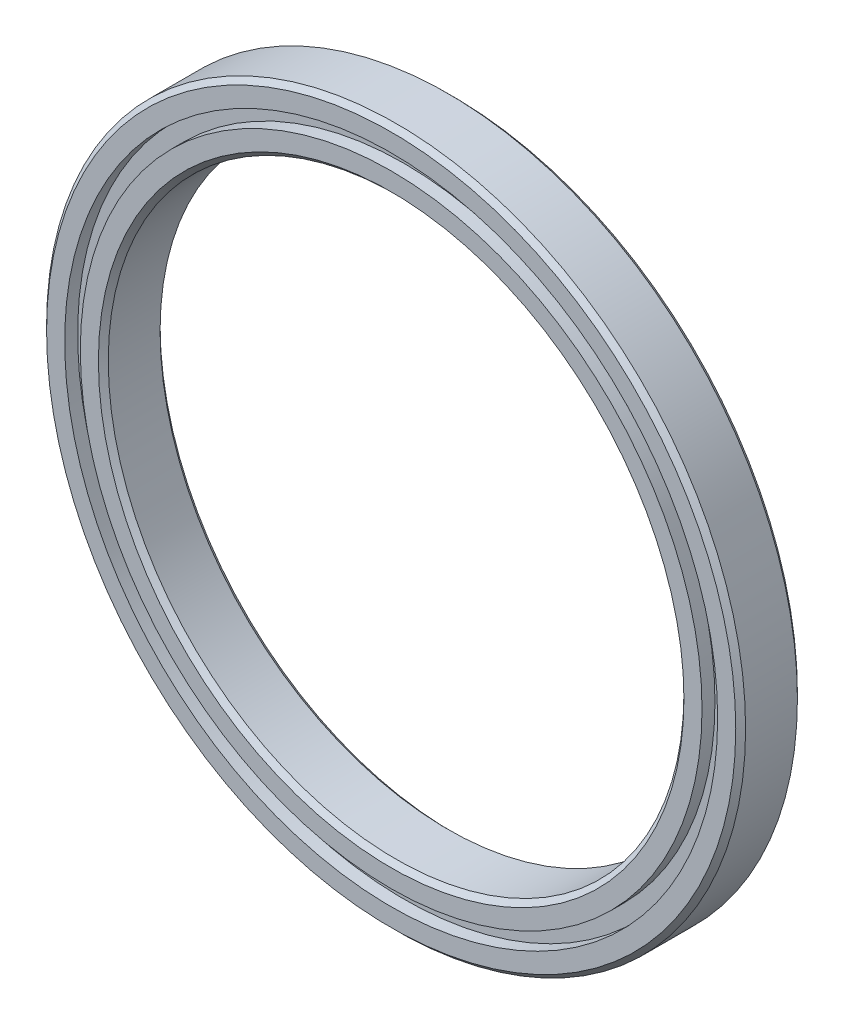
ISO-10303-21;
HEADER;
FILE_DESCRIPTION(('STEP AP214'),'2;1');
FILE_NAME('part.step','',(''),(''),'','','');
FILE_SCHEMA(('AUTOMOTIVE_DESIGN { 1 0 10303 214 1 1 1 1 }'));
ENDSEC;
DATA;
#1=APPLICATION_CONTEXT('core data for automotive mechanical design processes');
#2=APPLICATION_PROTOCOL_DEFINITION('international standard','automotive_design',2000,#1);
#3=PRODUCT_CONTEXT('',#1,'mechanical');
#4=PRODUCT('Part','Part','',(#3));
#5=PRODUCT_RELATED_PRODUCT_CATEGORY('part','',(#4));
#6=PRODUCT_DEFINITION_FORMATION('','',#4);
#7=PRODUCT_DEFINITION_CONTEXT('part definition',#1,'design');
#8=PRODUCT_DEFINITION('design','',#6,#7);
#9=PRODUCT_DEFINITION_SHAPE('','',#8);
#10=(LENGTH_UNIT() NAMED_UNIT(*) SI_UNIT(.MILLI.,.METRE.));
#11=(NAMED_UNIT(*) PLANE_ANGLE_UNIT() SI_UNIT($,.RADIAN.));
#12=(NAMED_UNIT(*) SI_UNIT($,.STERADIAN.) SOLID_ANGLE_UNIT());
#13=UNCERTAINTY_MEASURE_WITH_UNIT(LENGTH_MEASURE(1.E-05),#10,'distance_accuracy_value','');
#14=(GEOMETRIC_REPRESENTATION_CONTEXT(3) GLOBAL_UNCERTAINTY_ASSIGNED_CONTEXT((#13)) GLOBAL_UNIT_ASSIGNED_CONTEXT((#10,
#11,#12)) REPRESENTATION_CONTEXT('',''));
#15=CARTESIAN_POINT('',(0.,0.,0.));
#16=DIRECTION('',(0.,0.,1.));
#17=DIRECTION('',(1.,0.,0.));
#18=AXIS2_PLACEMENT_3D('',#15,#16,#17);
#19=CARTESIAN_POINT('',(-4.53884847591723,-45.5319593320098,0.));
#20=DIRECTION('',(0.,0.,1.));
#21=DIRECTION('',(1.,0.,0.));
#22=AXIS2_PLACEMENT_3D('',#19,#20,#21);
#23=PLANE('',#22);
#24=CARTESIAN_POINT('',(-4.53884847591723,-45.5319593320098,0.));
#25=DIRECTION('',(0.,0.,1.));
#26=DIRECTION('',(1.,0.,0.));
#27=AXIS2_PLACEMENT_3D('',#24,#25,#26);
#28=CIRCLE('',#27,22.606);
#29=CARTESIAN_POINT('',(18.0671515240827,-45.5319593320098,0.));
#30=VERTEX_POINT('',#29);
#31=EDGE_CURVE('E59',#30,#30,#28,.T.);
#32=ORIENTED_EDGE('',*,*,#31,.T.);
#33=EDGE_LOOP('',(#32));
#34=FACE_BOUND('',#33,.T.);
#35=CARTESIAN_POINT('',(-4.53884847591723,-45.5319593320098,0.));
#36=DIRECTION('',(0.,0.,-1.));
#37=DIRECTION('',(-1.,0.,0.));
#38=AXIS2_PLACEMENT_3D('',#35,#36,#37);
#39=CIRCLE('',#38,24.003);
#40=CARTESIAN_POINT('',(-28.5418484759172,-45.5319593320098,0.));
#41=VERTEX_POINT('',#40);
#42=EDGE_CURVE('E83',#41,#41,#39,.T.);
#43=ORIENTED_EDGE('',*,*,#42,.T.);
#44=EDGE_LOOP('',(#43));
#45=FACE_BOUND('',#44,.T.);
#46=ADVANCED_FACE('F30',(#34,#45),#23,.F.);
#47=CARTESIAN_POINT('',(-4.53884847591723,-45.5319593320098,4.7625));
#48=DIRECTION('',(0.,0.,1.));
#49=DIRECTION('',(1.,0.,0.));
#50=AXIS2_PLACEMENT_3D('',#47,#48,#49);
#51=PLANE('',#50);
#52=CARTESIAN_POINT('',(-4.53884847591723,-45.5319593320098,4.7625));
#53=DIRECTION('',(0.,0.,1.));
#54=DIRECTION('',(1.,0.,0.));
#55=AXIS2_PLACEMENT_3D('',#52,#53,#54);
#56=CIRCLE('',#55,22.6060000000001);
#57=CARTESIAN_POINT('',(18.0671515240828,-45.5319593320098,4.7625));
#58=VERTEX_POINT('',#57);
#59=EDGE_CURVE('E37',#58,#58,#56,.F.);
#60=ORIENTED_EDGE('',*,*,#59,.T.);
#61=EDGE_LOOP('',(#60));
#62=FACE_BOUND('',#61,.T.);
#63=CARTESIAN_POINT('',(-4.53884847591723,-45.5319593320098,4.7625));
#64=DIRECTION('',(0.,0.,1.));
#65=DIRECTION('',(1.,0.,0.));
#66=AXIS2_PLACEMENT_3D('',#63,#64,#65);
#67=CIRCLE('',#66,24.003);
#68=CARTESIAN_POINT('',(19.4641515240828,-45.5319593320098,4.7625));
#69=VERTEX_POINT('',#68);
#70=EDGE_CURVE('E71',#69,#69,#67,.T.);
#71=ORIENTED_EDGE('',*,*,#70,.T.);
#72=EDGE_LOOP('',(#71));
#73=FACE_BOUND('',#72,.T.);
#74=ADVANCED_FACE('F105',(#62,#73),#51,.T.);
#75=CARTESIAN_POINT('',(-4.53884847591723,-45.5319593320098,4.7625));
#76=DIRECTION('',(0.,0.,1.));
#77=DIRECTION('',(1.,0.,0.));
#78=AXIS2_PLACEMENT_3D('',#75,#76,#77);
#79=CIRCLE('',#78,26.6065);
#80=CARTESIAN_POINT('',(22.0676515240828,-45.5319593320098,4.7625));
#81=VERTEX_POINT('',#80);
#82=EDGE_CURVE('E10',#81,#81,#79,.T.);
#83=ORIENTED_EDGE('',*,*,#82,.T.);
#84=EDGE_LOOP('',(#83));
#85=FACE_BOUND('',#84,.T.);
#86=CARTESIAN_POINT('',(-4.53884847591723,-45.5319593320098,4.7625));
#87=DIRECTION('',(0.,0.,1.));
#88=DIRECTION('',(1.,0.,0.));
#89=AXIS2_PLACEMENT_3D('',#86,#87,#88);
#90=CIRCLE('',#89,25.2095);
#91=CARTESIAN_POINT('',(20.6706515240828,-45.5319593320098,4.7625));
#92=VERTEX_POINT('',#91);
#93=EDGE_CURVE('E65',#92,#92,#90,.T.);
#94=ORIENTED_EDGE('',*,*,#93,.F.);
#95=EDGE_LOOP('',(#94));
#96=FACE_BOUND('',#95,.T.);
#97=ADVANCED_FACE('F112',(#85,#96),#51,.T.);
#98=CARTESIAN_POINT('',(-4.53884847591723,-45.5319593320098,0.));
#99=DIRECTION('',(0.,0.,1.));
#100=DIRECTION('',(1.,0.,0.));
#101=AXIS2_PLACEMENT_3D('',#98,#99,#100);
#102=CIRCLE('',#101,26.6065);
#103=CARTESIAN_POINT('',(22.0676515240827,-45.5319593320098,0.));
#104=VERTEX_POINT('',#103);
#105=EDGE_CURVE('E41',#104,#104,#102,.F.);
#106=ORIENTED_EDGE('',*,*,#105,.T.);
#107=EDGE_LOOP('',(#106));
#108=FACE_BOUND('',#107,.T.);
#109=CARTESIAN_POINT('',(-4.53884847591723,-45.5319593320098,0.));
#110=DIRECTION('',(0.,0.,-1.));
#111=DIRECTION('',(-1.,0.,0.));
#112=AXIS2_PLACEMENT_3D('',#109,#110,#111);
#113=CIRCLE('',#112,25.2095);
#114=CARTESIAN_POINT('',(-29.7483484759172,-45.5319593320098,0.));
#115=VERTEX_POINT('',#114);
#116=EDGE_CURVE('E77',#115,#115,#113,.T.);
#117=ORIENTED_EDGE('',*,*,#116,.F.);
#118=EDGE_LOOP('',(#117));
#119=FACE_BOUND('',#118,.T.);
#120=ADVANCED_FACE('F108',(#108,#119),#23,.F.);
#121=CARTESIAN_POINT('',(-4.53884847591723,-45.5319593320098,4.7625));
#122=DIRECTION('',(0.,0.,-1.));
#123=DIRECTION('',(-1.,0.,0.));
#124=AXIS2_PLACEMENT_3D('',#121,#122,#123);
#125=CYLINDRICAL_SURFACE('',#124,26.9875);
#126=CARTESIAN_POINT('',(-4.53884847591723,-45.5319593320098,0.381000000000034));
#127=DIRECTION('',(0.,0.,1.));
#128=DIRECTION('',(1.,0.,0.));
#129=AXIS2_PLACEMENT_3D('',#126,#127,#128);
#130=CIRCLE('',#129,26.9875);
#131=CARTESIAN_POINT('',(-31.5263484759172,-45.5319593320098,0.381000000000034));
#132=VERTEX_POINT('',#131);
#133=EDGE_CURVE('E45',#132,#132,#130,.T.);
#134=CARTESIAN_POINT('',(-4.53884847591723,-45.5319593320098,4.38150000000002));
#135=DIRECTION('',(0.,0.,1.));
#136=DIRECTION('',(1.,0.,0.));
#137=AXIS2_PLACEMENT_3D('',#134,#135,#136);
#138=CIRCLE('',#137,26.9875);
#139=CARTESIAN_POINT('',(-31.5263484759172,-45.5319593320098,4.38150000000002));
#140=VERTEX_POINT('',#139);
#141=EDGE_CURVE('E50',#140,#140,#138,.F.);
#142=CARTESIAN_POINT('',(-31.5263484759172,-45.5319593320098,0.381000000000034));
#143=CARTESIAN_POINT('',(-31.5263484759172,-45.5319593320098,0.422671875000034));
#144=CARTESIAN_POINT('',(-31.5263484759172,-45.5319593320098,0.464343750000034));
#145=CARTESIAN_POINT('',(-31.5263484759172,-45.5319593320098,0.547687500000033));
#146=CARTESIAN_POINT('',(-31.5263484759172,-45.5319593320098,0.589359375000033));
#147=CARTESIAN_POINT('',(-31.5263484759172,-45.5319593320098,0.672703125000032));
#148=CARTESIAN_POINT('',(-31.5263484759172,-45.5319593320098,0.714375000000032));
#149=CARTESIAN_POINT('',(-31.5263484759172,-45.5319593320098,0.797718750000032));
#150=CARTESIAN_POINT('',(-31.5263484759172,-45.5319593320098,0.839390625000032));
#151=CARTESIAN_POINT('',(-31.5263484759172,-45.5319593320098,0.922734375000031));
#152=CARTESIAN_POINT('',(-31.5263484759172,-45.5319593320098,0.964406250000031));
#153=CARTESIAN_POINT('',(-31.5263484759172,-45.5319593320098,1.04775000000003));
#154=CARTESIAN_POINT('',(-31.5263484759172,-45.5319593320098,1.08942187500003));
#155=CARTESIAN_POINT('',(-31.5263484759172,-45.5319593320098,1.17276562500003));
#156=CARTESIAN_POINT('',(-31.5263484759172,-45.5319593320098,1.21443750000003));
#157=CARTESIAN_POINT('',(-31.5263484759172,-45.5319593320098,1.29778125000003));
#158=CARTESIAN_POINT('',(-31.5263484759172,-45.5319593320098,1.33945312500003));
#159=CARTESIAN_POINT('',(-31.5263484759172,-45.5319593320098,1.42279687500003));
#160=CARTESIAN_POINT('',(-31.5263484759172,-45.5319593320098,1.46446875000003));
#161=CARTESIAN_POINT('',(-31.5263484759172,-45.5319593320098,1.54781250000003));
#162=CARTESIAN_POINT('',(-31.5263484759172,-45.5319593320098,1.58948437500003));
#163=CARTESIAN_POINT('',(-31.5263484759172,-45.5319593320098,1.67282812500003));
#164=CARTESIAN_POINT('',(-31.5263484759172,-45.5319593320098,1.71450000000003));
#165=CARTESIAN_POINT('',(-31.5263484759172,-45.5319593320098,1.79784375000003));
#166=CARTESIAN_POINT('',(-31.5263484759172,-45.5319593320098,1.83951562500003));
#167=CARTESIAN_POINT('',(-31.5263484759172,-45.5319593320098,1.92285937500003));
#168=CARTESIAN_POINT('',(-31.5263484759172,-45.5319593320098,1.96453125000003));
#169=CARTESIAN_POINT('',(-31.5263484759172,-45.5319593320098,2.04787500000003));
#170=CARTESIAN_POINT('',(-31.5263484759172,-45.5319593320098,2.08954687500003));
#171=CARTESIAN_POINT('',(-31.5263484759172,-45.5319593320098,2.17289062500003));
#172=CARTESIAN_POINT('',(-31.5263484759172,-45.5319593320098,2.21456250000003));
#173=CARTESIAN_POINT('',(-31.5263484759172,-45.5319593320098,2.29790625000002));
#174=CARTESIAN_POINT('',(-31.5263484759172,-45.5319593320098,2.33957812500002));
#175=CARTESIAN_POINT('',(-31.5263484759172,-45.5319593320098,2.42292187500002));
#176=CARTESIAN_POINT('',(-31.5263484759172,-45.5319593320098,2.46459375000002));
#177=CARTESIAN_POINT('',(-31.5263484759172,-45.5319593320098,2.54793750000002));
#178=CARTESIAN_POINT('',(-31.5263484759172,-45.5319593320098,2.58960937500002));
#179=CARTESIAN_POINT('',(-31.5263484759172,-45.5319593320098,2.67295312500002));
#180=CARTESIAN_POINT('',(-31.5263484759172,-45.5319593320098,2.71462500000002));
#181=CARTESIAN_POINT('',(-31.5263484759172,-45.5319593320098,2.79796875000002));
#182=CARTESIAN_POINT('',(-31.5263484759172,-45.5319593320098,2.83964062500002));
#183=CARTESIAN_POINT('',(-31.5263484759172,-45.5319593320098,2.92298437500002));
#184=CARTESIAN_POINT('',(-31.5263484759172,-45.5319593320098,2.96465625000002));
#185=CARTESIAN_POINT('',(-31.5263484759172,-45.5319593320098,3.04800000000002));
#186=CARTESIAN_POINT('',(-31.5263484759172,-45.5319593320098,3.08967187500002));
#187=CARTESIAN_POINT('',(-31.5263484759172,-45.5319593320098,3.17301562500002));
#188=CARTESIAN_POINT('',(-31.5263484759172,-45.5319593320098,3.21468750000002));
#189=CARTESIAN_POINT('',(-31.5263484759172,-45.5319593320098,3.29803125000002));
#190=CARTESIAN_POINT('',(-31.5263484759172,-45.5319593320098,3.33970312500002));
#191=CARTESIAN_POINT('',(-31.5263484759172,-45.5319593320098,3.42304687500002));
#192=CARTESIAN_POINT('',(-31.5263484759172,-45.5319593320098,3.46471875000002));
#193=CARTESIAN_POINT('',(-31.5263484759172,-45.5319593320098,3.54806250000002));
#194=CARTESIAN_POINT('',(-31.5263484759172,-45.5319593320098,3.58973437500002));
#195=CARTESIAN_POINT('',(-31.5263484759172,-45.5319593320098,3.67307812500002));
#196=CARTESIAN_POINT('',(-31.5263484759172,-45.5319593320098,3.71475000000002));
#197=CARTESIAN_POINT('',(-31.5263484759172,-45.5319593320098,3.79809375000002));
#198=CARTESIAN_POINT('',(-31.5263484759172,-45.5319593320098,3.83976562500002));
#199=CARTESIAN_POINT('',(-31.5263484759172,-45.5319593320098,3.92310937500002));
#200=CARTESIAN_POINT('',(-31.5263484759172,-45.5319593320098,3.96478125000002));
#201=CARTESIAN_POINT('',(-31.5263484759172,-45.5319593320098,4.04812500000002));
#202=CARTESIAN_POINT('',(-31.5263484759172,-45.5319593320098,4.08979687500002));
#203=CARTESIAN_POINT('',(-31.5263484759172,-45.5319593320098,4.17314062500002));
#204=CARTESIAN_POINT('',(-31.5263484759172,-45.5319593320098,4.21481250000002));
#205=CARTESIAN_POINT('',(-31.5263484759172,-45.5319593320098,4.29815625000002));
#206=CARTESIAN_POINT('',(-31.5263484759172,-45.5319593320098,4.33982812500002));
#207=CARTESIAN_POINT('',(-31.5263484759172,-45.5319593320098,4.38150000000002));
#208=B_SPLINE_CURVE_WITH_KNOTS('',3,(#142,#143,#144,#145,#146,#147,#148,#149,#150,#151,#152,
#153,#154,#155,#156,#157,#158,#159,#160,#161,#162,#163,#164,#165,#166,#167,#168,#169,#170,#171,
#172,#173,#174,#175,#176,#177,#178,#179,#180,#181,#182,#183,#184,#185,#186,#187,#188,#189,#190,
#191,#192,#193,#194,#195,#196,#197,#198,#199,#200,#201,#202,#203,#204,#205,#206,#207),
.UNSPECIFIED.,.F.,.F.,(4,2,2,2,2,2,2,2,2,2,2,2,2,2,2,2,2,2,2,2,2,2,2,2,2,2,2,2,2,2,2,2,4),(0.,
0.125015625,0.250031249999999,0.375046874999998,0.500062499999998,0.625078124999997,
0.750093749999996,0.875109374999996,1.000125,1.12514062499999,1.25015624999999,1.37517187499999,
1.50018749999999,1.62520312499999,1.75021874999999,1.87523437499999,2.00024999999999,
2.12526562499999,2.25028124999999,2.37529687499999,2.50031249999999,2.62532812499999,
2.75034374999999,2.87535937499999,3.00037499999999,3.12539062499998,3.25040624999998,
3.37542187499998,3.50043749999998,3.62545312499998,3.75046874999998,3.87548437499998,
4.00049999999998),.UNSPECIFIED.);
#209=EDGE_CURVE('BSEAM32',#132,#140,#208,.T.);
#210=ORIENTED_EDGE('',*,*,#133,.T.);
#211=ORIENTED_EDGE('',*,*,#141,.T.);
#212=ORIENTED_EDGE('',*,*,#209,.T.);
#213=ORIENTED_EDGE('',*,*,#209,.F.);
#214=EDGE_LOOP('',(#210,#212,#211,#213));
#215=FACE_BOUND('',#214,.T.);
#216=ADVANCED_FACE('F32',(#215),#125,.T.);
#217=CARTESIAN_POINT('',(-4.53884847591723,-45.5319593320098,4.7625));
#218=DIRECTION('',(0.,0.,-1.));
#219=DIRECTION('',(-1.,0.,0.));
#220=AXIS2_PLACEMENT_3D('',#217,#218,#219);
#221=CYLINDRICAL_SURFACE('',#220,22.225);
#222=CARTESIAN_POINT('',(-4.53884847591723,-45.5319593320098,0.380999999999982));
#223=DIRECTION('',(0.,0.,1.));
#224=DIRECTION('',(1.,0.,0.));
#225=AXIS2_PLACEMENT_3D('',#222,#223,#224);
#226=CIRCLE('',#225,22.225);
#227=CARTESIAN_POINT('',(-26.7638484759172,-45.5319593320098,0.380999999999982));
#228=VERTEX_POINT('',#227);
#229=EDGE_CURVE('E53',#228,#228,#226,.F.);
#230=CARTESIAN_POINT('',(-4.53884847591723,-45.5319593320098,4.38149999999993));
#231=DIRECTION('',(0.,0.,1.));
#232=DIRECTION('',(1.,0.,0.));
#233=AXIS2_PLACEMENT_3D('',#230,#231,#232);
#234=CIRCLE('',#233,22.225);
#235=CARTESIAN_POINT('',(-26.7638484759172,-45.5319593320098,4.38149999999993));
#236=VERTEX_POINT('',#235);
#237=EDGE_CURVE('E56',#236,#236,#234,.T.);
#238=CARTESIAN_POINT('',(-26.7638484759172,-45.5319593320098,0.380999999999982));
#239=CARTESIAN_POINT('',(-26.7638484759172,-45.5319593320098,0.422671874999982));
#240=CARTESIAN_POINT('',(-26.7638484759172,-45.5319593320098,0.464343749999981));
#241=CARTESIAN_POINT('',(-26.7638484759172,-45.5319593320098,0.54768749999998));
#242=CARTESIAN_POINT('',(-26.7638484759172,-45.5319593320098,0.58935937499998));
#243=CARTESIAN_POINT('',(-26.7638484759172,-45.5319593320098,0.672703124999978));
#244=CARTESIAN_POINT('',(-26.7638484759172,-45.5319593320098,0.714374999999978));
#245=CARTESIAN_POINT('',(-26.7638484759172,-45.5319593320098,0.797718749999977));
#246=CARTESIAN_POINT('',(-26.7638484759172,-45.5319593320098,0.839390624999976));
#247=CARTESIAN_POINT('',(-26.7638484759172,-45.5319593320098,0.922734374999975));
#248=CARTESIAN_POINT('',(-26.7638484759172,-45.5319593320098,0.964406249999974));
#249=CARTESIAN_POINT('',(-26.7638484759172,-45.5319593320098,1.04774999999997));
#250=CARTESIAN_POINT('',(-26.7638484759172,-45.5319593320098,1.08942187499997));
#251=CARTESIAN_POINT('',(-26.7638484759172,-45.5319593320098,1.17276562499997));
#252=CARTESIAN_POINT('',(-26.7638484759172,-45.5319593320098,1.21443749999997));
#253=CARTESIAN_POINT('',(-26.7638484759172,-45.5319593320098,1.29778124999997));
#254=CARTESIAN_POINT('',(-26.7638484759172,-45.5319593320098,1.33945312499997));
#255=CARTESIAN_POINT('',(-26.7638484759172,-45.5319593320098,1.42279687499997));
#256=CARTESIAN_POINT('',(-26.7638484759172,-45.5319593320098,1.46446874999997));
#257=CARTESIAN_POINT('',(-26.7638484759172,-45.5319593320098,1.54781249999997));
#258=CARTESIAN_POINT('',(-26.7638484759172,-45.5319593320098,1.58948437499997));
#259=CARTESIAN_POINT('',(-26.7638484759172,-45.5319593320098,1.67282812499997));
#260=CARTESIAN_POINT('',(-26.7638484759172,-45.5319593320098,1.71449999999997));
#261=CARTESIAN_POINT('',(-26.7638484759172,-45.5319593320098,1.79784374999996));
#262=CARTESIAN_POINT('',(-26.7638484759172,-45.5319593320098,1.83951562499996));
#263=CARTESIAN_POINT('',(-26.7638484759172,-45.5319593320098,1.92285937499996));
#264=CARTESIAN_POINT('',(-26.7638484759172,-45.5319593320098,1.96453124999996));
#265=CARTESIAN_POINT('',(-26.7638484759172,-45.5319593320098,2.04787499999996));
#266=CARTESIAN_POINT('',(-26.7638484759172,-45.5319593320098,2.08954687499996));
#267=CARTESIAN_POINT('',(-26.7638484759172,-45.5319593320098,2.17289062499996));
#268=CARTESIAN_POINT('',(-26.7638484759172,-45.5319593320098,2.21456249999996));
#269=CARTESIAN_POINT('',(-26.7638484759172,-45.5319593320098,2.29790624999996));
#270=CARTESIAN_POINT('',(-26.7638484759172,-45.5319593320098,2.33957812499996));
#271=CARTESIAN_POINT('',(-26.7638484759172,-45.5319593320098,2.42292187499996));
#272=CARTESIAN_POINT('',(-26.7638484759172,-45.5319593320098,2.46459374999996));
#273=CARTESIAN_POINT('',(-26.7638484759172,-45.5319593320098,2.54793749999995));
#274=CARTESIAN_POINT('',(-26.7638484759172,-45.5319593320098,2.58960937499995));
#275=CARTESIAN_POINT('',(-26.7638484759172,-45.5319593320098,2.67295312499995));
#276=CARTESIAN_POINT('',(-26.7638484759172,-45.5319593320098,2.71462499999995));
#277=CARTESIAN_POINT('',(-26.7638484759172,-45.5319593320098,2.79796874999995));
#278=CARTESIAN_POINT('',(-26.7638484759172,-45.5319593320098,2.83964062499995));
#279=CARTESIAN_POINT('',(-26.7638484759172,-45.5319593320098,2.92298437499995));
#280=CARTESIAN_POINT('',(-26.7638484759172,-45.5319593320098,2.96465624999995));
#281=CARTESIAN_POINT('',(-26.7638484759172,-45.5319593320098,3.04799999999995));
#282=CARTESIAN_POINT('',(-26.7638484759172,-45.5319593320098,3.08967187499995));
#283=CARTESIAN_POINT('',(-26.7638484759172,-45.5319593320098,3.17301562499995));
#284=CARTESIAN_POINT('',(-26.7638484759172,-45.5319593320098,3.21468749999995));
#285=CARTESIAN_POINT('',(-26.7638484759172,-45.5319593320098,3.29803124999995));
#286=CARTESIAN_POINT('',(-26.7638484759172,-45.5319593320098,3.33970312499994));
#287=CARTESIAN_POINT('',(-26.7638484759172,-45.5319593320098,3.42304687499994));
#288=CARTESIAN_POINT('',(-26.7638484759172,-45.5319593320098,3.46471874999994));
#289=CARTESIAN_POINT('',(-26.7638484759172,-45.5319593320098,3.54806249999994));
#290=CARTESIAN_POINT('',(-26.7638484759172,-45.5319593320098,3.58973437499994));
#291=CARTESIAN_POINT('',(-26.7638484759172,-45.5319593320098,3.67307812499994));
#292=CARTESIAN_POINT('',(-26.7638484759172,-45.5319593320098,3.71474999999994));
#293=CARTESIAN_POINT('',(-26.7638484759172,-45.5319593320098,3.79809374999994));
#294=CARTESIAN_POINT('',(-26.7638484759172,-45.5319593320098,3.83976562499994));
#295=CARTESIAN_POINT('',(-26.7638484759172,-45.5319593320098,3.92310937499994));
#296=CARTESIAN_POINT('',(-26.7638484759172,-45.5319593320098,3.96478124999994));
#297=CARTESIAN_POINT('',(-26.7638484759172,-45.5319593320098,4.04812499999994));
#298=CARTESIAN_POINT('',(-26.7638484759172,-45.5319593320098,4.08979687499994));
#299=CARTESIAN_POINT('',(-26.7638484759172,-45.5319593320098,4.17314062499993));
#300=CARTESIAN_POINT('',(-26.7638484759172,-45.5319593320098,4.21481249999993));
#301=CARTESIAN_POINT('',(-26.7638484759172,-45.5319593320098,4.29815624999993));
#302=CARTESIAN_POINT('',(-26.7638484759172,-45.5319593320098,4.33982812499993));
#303=CARTESIAN_POINT('',(-26.7638484759172,-45.5319593320098,4.38149999999993));
#304=B_SPLINE_CURVE_WITH_KNOTS('',3,(#238,#239,#240,#241,#242,#243,#244,#245,#246,#247,#248,
#249,#250,#251,#252,#253,#254,#255,#256,#257,#258,#259,#260,#261,#262,#263,#264,#265,#266,#267,
#268,#269,#270,#271,#272,#273,#274,#275,#276,#277,#278,#279,#280,#281,#282,#283,#284,#285,#286,
#287,#288,#289,#290,#291,#292,#293,#294,#295,#296,#297,#298,#299,#300,#301,#302,#303),
.UNSPECIFIED.,.F.,.F.,(4,2,2,2,2,2,2,2,2,2,2,2,2,2,2,2,2,2,2,2,2,2,2,2,2,2,2,2,2,2,2,2,4),(0.,
0.125015624999999,0.250031249999997,0.375046874999996,0.500062499999993,0.625078124999992,
0.75009374999999,0.875109374999989,1.00012499999999,1.12514062499999,1.25015624999998,
1.37517187499998,1.50018749999998,1.62520312499998,1.75021874999998,1.87523437499998,
2.00024999999997,2.12526562499997,2.25028124999997,2.37529687499997,2.50031249999997,
2.62532812499997,2.75034374999997,2.87535937499996,3.00037499999996,3.12539062499996,
3.25040624999996,3.37542187499996,3.50043749999996,3.62545312499995,3.75046874999995,
3.87548437499995,4.00049999999995),.UNSPECIFIED.);
#305=EDGE_CURVE('BSEAM120',#228,#236,#304,.T.);
#306=ORIENTED_EDGE('',*,*,#229,.T.);
#307=ORIENTED_EDGE('',*,*,#237,.T.);
#308=ORIENTED_EDGE('',*,*,#305,.T.);
#309=ORIENTED_EDGE('',*,*,#305,.F.);
#310=EDGE_LOOP('',(#306,#308,#307,#309));
#311=FACE_BOUND('',#310,.T.);
#312=ADVANCED_FACE('F120',(#311),#221,.F.);
#313=CARTESIAN_POINT('',(-4.53884847591723,-45.5319593320098,3.7625));
#314=DIRECTION('',(0.,0.,1.));
#315=DIRECTION('',(1.,0.,0.));
#316=AXIS2_PLACEMENT_3D('',#313,#314,#315);
#317=CYLINDRICAL_SURFACE('',#316,25.2095);
#318=CARTESIAN_POINT('',(-4.53884847591723,-45.5319593320098,3.7625));
#319=DIRECTION('',(0.,0.,1.));
#320=DIRECTION('',(1.,0.,0.));
#321=AXIS2_PLACEMENT_3D('',#318,#319,#320);
#322=CIRCLE('',#321,25.2095);
#323=CARTESIAN_POINT('',(20.6706515240828,-45.5319593320098,3.7625));
#324=VERTEX_POINT('',#323);
#325=EDGE_CURVE('E62',#324,#324,#322,.T.);
#326=ORIENTED_EDGE('',*,*,#325,.F.);
#327=EDGE_LOOP('',(#326));
#328=FACE_BOUND('',#327,.T.);
#329=ORIENTED_EDGE('',*,*,#93,.T.);
#330=EDGE_LOOP('',(#329));
#331=FACE_BOUND('',#330,.T.);
#332=ADVANCED_FACE('F140',(#328,#331),#317,.F.);
#333=CARTESIAN_POINT('',(-4.53884847591723,-45.5319593320098,3.7625));
#334=DIRECTION('',(0.,0.,1.));
#335=DIRECTION('',(1.,0.,0.));
#336=AXIS2_PLACEMENT_3D('',#333,#334,#335);
#337=PLANE('',#336);
#338=CARTESIAN_POINT('',(-4.53884847591723,-45.5319593320098,3.7625));
#339=DIRECTION('',(0.,0.,1.));
#340=DIRECTION('',(1.,0.,0.));
#341=AXIS2_PLACEMENT_3D('',#338,#339,#340);
#342=CIRCLE('',#341,24.003);
#343=CARTESIAN_POINT('',(19.4641515240828,-45.5319593320098,3.7625));
#344=VERTEX_POINT('',#343);
#345=EDGE_CURVE('E68',#344,#344,#342,.T.);
#346=ORIENTED_EDGE('',*,*,#345,.F.);
#347=EDGE_LOOP('',(#346));
#348=FACE_BOUND('',#347,.T.);
#349=ORIENTED_EDGE('',*,*,#325,.T.);
#350=EDGE_LOOP('',(#349));
#351=FACE_BOUND('',#350,.T.);
#352=ADVANCED_FACE('F133',(#348,#351),#337,.T.);
#353=CARTESIAN_POINT('',(-4.53884847591723,-45.5319593320098,3.7625));
#354=DIRECTION('',(0.,0.,1.));
#355=DIRECTION('',(1.,0.,0.));
#356=AXIS2_PLACEMENT_3D('',#353,#354,#355);
#357=CYLINDRICAL_SURFACE('',#356,24.003);
#358=ORIENTED_EDGE('',*,*,#345,.T.);
#359=EDGE_LOOP('',(#358));
#360=FACE_BOUND('',#359,.T.);
#361=ORIENTED_EDGE('',*,*,#70,.F.);
#362=EDGE_LOOP('',(#361));
#363=FACE_BOUND('',#362,.T.);
#364=ADVANCED_FACE('F127',(#360,#363),#357,.T.);
#365=CARTESIAN_POINT('',(-4.53884847591723,-45.5319593320098,1.));
#366=DIRECTION('',(0.,0.,-1.));
#367=DIRECTION('',(-1.,0.,0.));
#368=AXIS2_PLACEMENT_3D('',#365,#366,#367);
#369=CYLINDRICAL_SURFACE('',#368,25.2095);
#370=CARTESIAN_POINT('',(-4.53884847591723,-45.5319593320098,1.));
#371=DIRECTION('',(0.,0.,-1.));
#372=DIRECTION('',(-1.,0.,0.));
#373=AXIS2_PLACEMENT_3D('',#370,#371,#372);
#374=CIRCLE('',#373,25.2095);
#375=CARTESIAN_POINT('',(-29.7483484759172,-45.5319593320098,1.));
#376=VERTEX_POINT('',#375);
#377=EDGE_CURVE('E74',#376,#376,#374,.T.);
#378=ORIENTED_EDGE('',*,*,#377,.F.);
#379=EDGE_LOOP('',(#378));
#380=FACE_BOUND('',#379,.T.);
#381=ORIENTED_EDGE('',*,*,#116,.T.);
#382=EDGE_LOOP('',(#381));
#383=FACE_BOUND('',#382,.T.);
#384=ADVANCED_FACE('F101',(#380,#383),#369,.F.);
#385=CARTESIAN_POINT('',(-4.53884847591723,-45.5319593320098,1.));
#386=DIRECTION('',(0.,0.,-1.));
#387=DIRECTION('',(-1.,0.,0.));
#388=AXIS2_PLACEMENT_3D('',#385,#386,#387);
#389=PLANE('',#388);
#390=CARTESIAN_POINT('',(-4.53884847591723,-45.5319593320098,1.));
#391=DIRECTION('',(0.,0.,-1.));
#392=DIRECTION('',(-1.,0.,0.));
#393=AXIS2_PLACEMENT_3D('',#390,#391,#392);
#394=CIRCLE('',#393,24.003);
#395=CARTESIAN_POINT('',(-28.5418484759172,-45.5319593320098,1.));
#396=VERTEX_POINT('',#395);
#397=EDGE_CURVE('E80',#396,#396,#394,.T.);
#398=ORIENTED_EDGE('',*,*,#397,.F.);
#399=EDGE_LOOP('',(#398));
#400=FACE_BOUND('',#399,.T.);
#401=ORIENTED_EDGE('',*,*,#377,.T.);
#402=EDGE_LOOP('',(#401));
#403=FACE_BOUND('',#402,.T.);
#404=ADVANCED_FACE('F91',(#400,#403),#389,.T.);
#405=CARTESIAN_POINT('',(-4.53884847591723,-45.5319593320098,1.));
#406=DIRECTION('',(0.,0.,-1.));
#407=DIRECTION('',(-1.,0.,0.));
#408=AXIS2_PLACEMENT_3D('',#405,#406,#407);
#409=CYLINDRICAL_SURFACE('',#408,24.003);
#410=ORIENTED_EDGE('',*,*,#397,.T.);
#411=EDGE_LOOP('',(#410));
#412=FACE_BOUND('',#411,.T.);
#413=ORIENTED_EDGE('',*,*,#42,.F.);
#414=EDGE_LOOP('',(#413));
#415=FACE_BOUND('',#414,.T.);
#416=ADVANCED_FACE('F88',(#412,#415),#409,.T.);
#417=CARTESIAN_POINT('',(-4.53884847591723,-45.5319593320098,0.));
#418=DIRECTION('',(0.,0.,-1.));
#419=DIRECTION('',(-1.,0.,0.));
#420=AXIS2_PLACEMENT_3D('',#417,#418,#419);
#421=CONICAL_SURFACE('',#420,22.606,0.785398163397444);
#422=ORIENTED_EDGE('',*,*,#229,.F.);
#423=EDGE_LOOP('',(#422));
#424=FACE_BOUND('',#423,.T.);
#425=ORIENTED_EDGE('',*,*,#31,.F.);
#426=EDGE_LOOP('',(#425));
#427=FACE_BOUND('',#426,.T.);
#428=ADVANCED_FACE('F90',(#424,#427),#421,.F.);
#429=CARTESIAN_POINT('',(-4.53884847591723,-45.5319593320098,0.381000000000034));
#430=DIRECTION('',(0.,0.,1.));
#431=DIRECTION('',(1.,0.,0.));
#432=AXIS2_PLACEMENT_3D('',#429,#430,#431);
#433=CONICAL_SURFACE('',#432,26.9875,0.785398163397448);
#434=ORIENTED_EDGE('',*,*,#105,.F.);
#435=EDGE_LOOP('',(#434));
#436=FACE_BOUND('',#435,.T.);
#437=ORIENTED_EDGE('',*,*,#133,.F.);
#438=EDGE_LOOP('',(#437));
#439=FACE_BOUND('',#438,.T.);
#440=ADVANCED_FACE('F98',(#436,#439),#433,.T.);
#441=CARTESIAN_POINT('',(-4.53884847591723,-45.5319593320098,4.38149999999993));
#442=DIRECTION('',(0.,0.,1.));
#443=DIRECTION('',(1.,0.,0.));
#444=AXIS2_PLACEMENT_3D('',#441,#442,#443);
#445=CONICAL_SURFACE('',#444,22.225,0.785398163397444);
#446=ORIENTED_EDGE('',*,*,#59,.F.);
#447=EDGE_LOOP('',(#446));
#448=FACE_BOUND('',#447,.T.);
#449=ORIENTED_EDGE('',*,*,#237,.F.);
#450=EDGE_LOOP('',(#449));
#451=FACE_BOUND('',#450,.T.);
#452=ADVANCED_FACE('F152',(#448,#451),#445,.F.);
#453=CARTESIAN_POINT('',(-4.53884847591723,-45.5319593320098,4.7625));
#454=DIRECTION('',(0.,0.,-1.));
#455=DIRECTION('',(-1.,0.,0.));
#456=AXIS2_PLACEMENT_3D('',#453,#454,#455);
#457=CONICAL_SURFACE('',#456,26.6065,0.785398163397448);
#458=ORIENTED_EDGE('',*,*,#141,.F.);
#459=EDGE_LOOP('',(#458));
#460=FACE_BOUND('',#459,.T.);
#461=ORIENTED_EDGE('',*,*,#82,.F.);
#462=EDGE_LOOP('',(#461));
#463=FACE_BOUND('',#462,.T.);
#464=ADVANCED_FACE('F154',(#460,#463),#457,.T.);
#465=CLOSED_SHELL('',(#46,#74,#97,#120,#216,#312,#332,#352,#364,#384,#404,#416,#428,#440,#452,#464));
#466=MANIFOLD_SOLID_BREP('B2',#465);
#467=ADVANCED_BREP_SHAPE_REPRESENTATION('',(#18,#466),#14);
#468=SHAPE_DEFINITION_REPRESENTATION(#9,#467);
ENDSEC;
END-ISO-10303-21;
